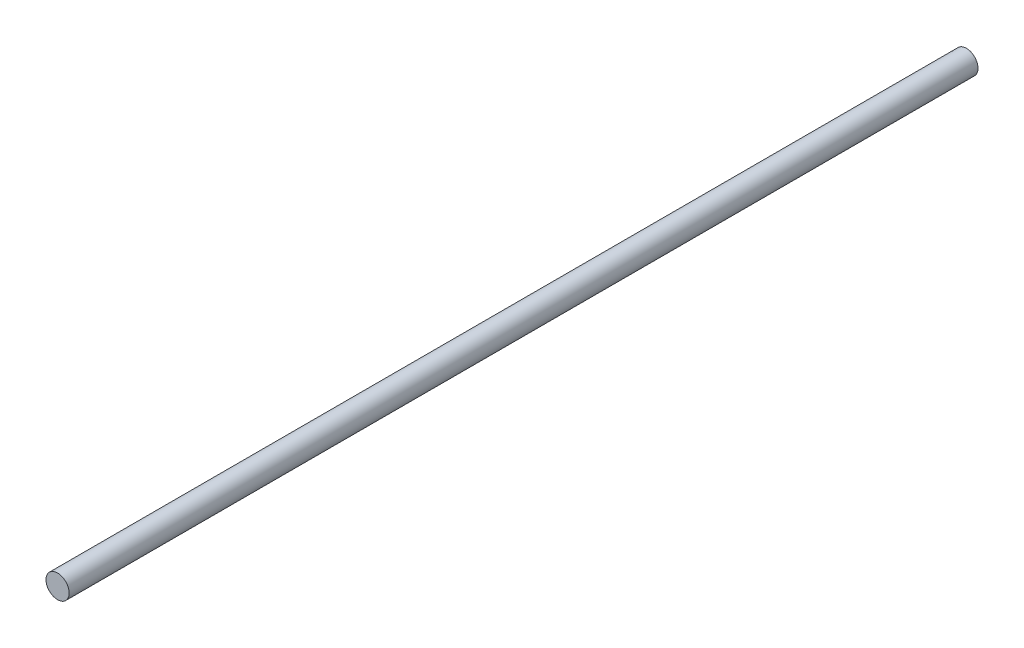
ISO-10303-21;
HEADER;
FILE_DESCRIPTION(('STEP AP214'),'2;1');
FILE_NAME('part.step','',(''),(''),'','','');
FILE_SCHEMA(('AUTOMOTIVE_DESIGN { 1 0 10303 214 1 1 1 1 }'));
ENDSEC;
DATA;
#1=APPLICATION_CONTEXT('core data for automotive mechanical design processes');
#2=APPLICATION_PROTOCOL_DEFINITION('international standard','automotive_design',2000,#1);
#3=PRODUCT_CONTEXT('',#1,'mechanical');
#4=PRODUCT('Part','Part','',(#3));
#5=PRODUCT_RELATED_PRODUCT_CATEGORY('part','',(#4));
#6=PRODUCT_DEFINITION_FORMATION('','',#4);
#7=PRODUCT_DEFINITION_CONTEXT('part definition',#1,'design');
#8=PRODUCT_DEFINITION('design','',#6,#7);
#9=PRODUCT_DEFINITION_SHAPE('','',#8);
#10=(LENGTH_UNIT() NAMED_UNIT(*) SI_UNIT(.MILLI.,.METRE.));
#11=(NAMED_UNIT(*) PLANE_ANGLE_UNIT() SI_UNIT($,.RADIAN.));
#12=(NAMED_UNIT(*) SI_UNIT($,.STERADIAN.) SOLID_ANGLE_UNIT());
#13=UNCERTAINTY_MEASURE_WITH_UNIT(LENGTH_MEASURE(1.E-05),#10,'distance_accuracy_value','');
#14=(GEOMETRIC_REPRESENTATION_CONTEXT(3) GLOBAL_UNCERTAINTY_ASSIGNED_CONTEXT((#13)) GLOBAL_UNIT_ASSIGNED_CONTEXT((#10,
#11,#12)) REPRESENTATION_CONTEXT('',''));
#15=CARTESIAN_POINT('',(0.,0.,0.));
#16=DIRECTION('',(0.,0.,1.));
#17=DIRECTION('',(1.,0.,0.));
#18=AXIS2_PLACEMENT_3D('',#15,#16,#17);
#19=CARTESIAN_POINT('',(0.,0.,98.));
#20=DIRECTION('',(0.,0.,-1.));
#21=DIRECTION('',(-1.,0.,0.));
#22=AXIS2_PLACEMENT_3D('',#19,#20,#21);
#23=CYLINDRICAL_SURFACE('',#22,2.5);
#24=CARTESIAN_POINT('',(0.,0.,98.));
#25=DIRECTION('',(0.,0.,1.));
#26=DIRECTION('',(1.,0.,0.));
#27=AXIS2_PLACEMENT_3D('',#24,#25,#26);
#28=CIRCLE('',#27,2.5);
#29=CARTESIAN_POINT('',(2.5,0.,98.));
#30=VERTEX_POINT('',#29);
#31=EDGE_CURVE('E10',#30,#30,#28,.T.);
#32=ORIENTED_EDGE('',*,*,#31,.F.);
#33=EDGE_LOOP('',(#32));
#34=FACE_BOUND('',#33,.T.);
#35=CARTESIAN_POINT('',(0.,0.,-98.));
#36=DIRECTION('',(0.,0.,1.));
#37=DIRECTION('',(1.,0.,0.));
#38=AXIS2_PLACEMENT_3D('',#35,#36,#37);
#39=CIRCLE('',#38,2.5);
#40=CARTESIAN_POINT('',(2.5,0.,-98.));
#41=VERTEX_POINT('',#40);
#42=EDGE_CURVE('E37',#41,#41,#39,.T.);
#43=ORIENTED_EDGE('',*,*,#42,.T.);
#44=EDGE_LOOP('',(#43));
#45=FACE_BOUND('',#44,.T.);
#46=ADVANCED_FACE('F34',(#34,#45),#23,.T.);
#47=CARTESIAN_POINT('',(0.,0.,98.));
#48=DIRECTION('',(0.,0.,1.));
#49=DIRECTION('',(1.,0.,0.));
#50=AXIS2_PLACEMENT_3D('',#47,#48,#49);
#51=PLANE('',#50);
#52=ORIENTED_EDGE('',*,*,#31,.T.);
#53=EDGE_LOOP('',(#52));
#54=FACE_BOUND('',#53,.T.);
#55=ADVANCED_FACE('F49',(#54),#51,.T.);
#56=CARTESIAN_POINT('',(0.,0.,-98.));
#57=DIRECTION('',(0.,0.,1.));
#58=DIRECTION('',(1.,0.,0.));
#59=AXIS2_PLACEMENT_3D('',#56,#57,#58);
#60=PLANE('',#59);
#61=ORIENTED_EDGE('',*,*,#42,.F.);
#62=EDGE_LOOP('',(#61));
#63=FACE_BOUND('',#62,.T.);
#64=ADVANCED_FACE('F47',(#63),#60,.F.);
#65=CLOSED_SHELL('',(#46,#55,#64));
#66=MANIFOLD_SOLID_BREP('B2',#65);
#67=ADVANCED_BREP_SHAPE_REPRESENTATION('',(#18,#66),#14);
#68=SHAPE_DEFINITION_REPRESENTATION(#9,#67);
ENDSEC;
END-ISO-10303-21;
